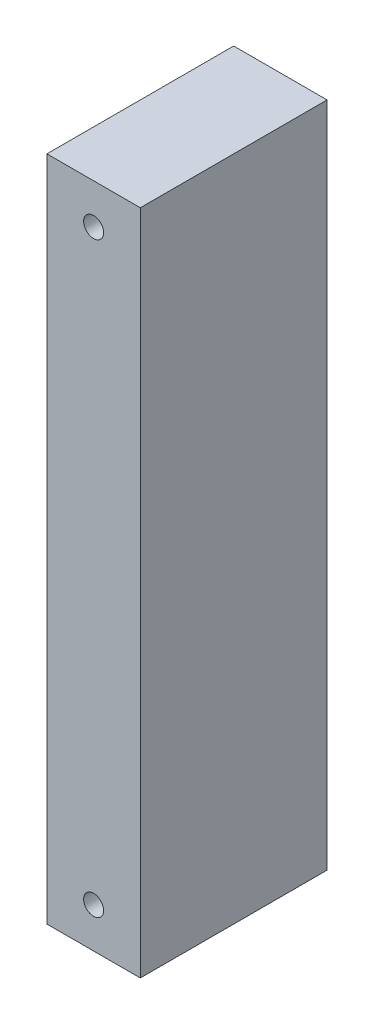
ISO-10303-21;
HEADER;
FILE_DESCRIPTION(('STEP AP214'),'2;1');
FILE_NAME('part.step','',(''),(''),'','','');
FILE_SCHEMA(('AUTOMOTIVE_DESIGN { 1 0 10303 214 1 1 1 1 }'));
ENDSEC;
DATA;
#1=APPLICATION_CONTEXT('core data for automotive mechanical design processes');
#2=APPLICATION_PROTOCOL_DEFINITION('international standard','automotive_design',2000,#1);
#3=PRODUCT_CONTEXT('',#1,'mechanical');
#4=PRODUCT('Part','Part','',(#3));
#5=PRODUCT_RELATED_PRODUCT_CATEGORY('part','',(#4));
#6=PRODUCT_DEFINITION_FORMATION('','',#4);
#7=PRODUCT_DEFINITION_CONTEXT('part definition',#1,'design');
#8=PRODUCT_DEFINITION('design','',#6,#7);
#9=PRODUCT_DEFINITION_SHAPE('','',#8);
#10=(LENGTH_UNIT() NAMED_UNIT(*) SI_UNIT(.MILLI.,.METRE.));
#11=(NAMED_UNIT(*) PLANE_ANGLE_UNIT() SI_UNIT($,.RADIAN.));
#12=(NAMED_UNIT(*) SI_UNIT($,.STERADIAN.) SOLID_ANGLE_UNIT());
#13=UNCERTAINTY_MEASURE_WITH_UNIT(LENGTH_MEASURE(1.E-05),#10,'distance_accuracy_value','');
#14=(GEOMETRIC_REPRESENTATION_CONTEXT(3) GLOBAL_UNCERTAINTY_ASSIGNED_CONTEXT((#13)) GLOBAL_UNIT_ASSIGNED_CONTEXT((#10,
#11,#12)) REPRESENTATION_CONTEXT('',''));
#15=CARTESIAN_POINT('',(0.,0.,0.));
#16=DIRECTION('',(0.,0.,1.));
#17=DIRECTION('',(1.,0.,0.));
#18=AXIS2_PLACEMENT_3D('',#15,#16,#17);
#19=CARTESIAN_POINT('',(0.,0.,14.));
#20=DIRECTION('',(0.,0.,-1.));
#21=DIRECTION('',(-1.,0.,0.));
#22=AXIS2_PLACEMENT_3D('',#19,#20,#21);
#23=PLANE('',#22);
#24=DIRECTION('',(0.,1.,0.));
#25=VECTOR('',#24,1.);
#26=CARTESIAN_POINT('',(3.5,-25.,14.));
#27=LINE('',#26,#25);
#28=CARTESIAN_POINT('',(3.5,-25.,14.));
#29=VERTEX_POINT('',#28);
#30=CARTESIAN_POINT('',(3.5,25.,14.));
#31=VERTEX_POINT('',#30);
#32=EDGE_CURVE('E85',#29,#31,#27,.T.);
#33=ORIENTED_EDGE('',*,*,#32,.T.);
#34=DIRECTION('',(-1.,0.,0.));
#35=VECTOR('',#34,1.);
#36=CARTESIAN_POINT('',(-3.5,25.,14.));
#37=LINE('',#36,#35);
#38=CARTESIAN_POINT('',(-3.5,25.,14.));
#39=VERTEX_POINT('',#38);
#40=EDGE_CURVE('E80',#31,#39,#37,.T.);
#41=ORIENTED_EDGE('',*,*,#40,.T.);
#42=DIRECTION('',(0.,-1.,0.));
#43=VECTOR('',#42,1.);
#44=CARTESIAN_POINT('',(-3.5,-25.,14.));
#45=LINE('',#44,#43);
#46=CARTESIAN_POINT('',(-3.5,-25.,14.));
#47=VERTEX_POINT('',#46);
#48=EDGE_CURVE('E83',#39,#47,#45,.T.);
#49=ORIENTED_EDGE('',*,*,#48,.T.);
#50=DIRECTION('',(1.,0.,0.));
#51=VECTOR('',#50,1.);
#52=CARTESIAN_POINT('',(-3.5,-25.,14.));
#53=LINE('',#52,#51);
#54=EDGE_CURVE('E50',#47,#29,#53,.T.);
#55=ORIENTED_EDGE('',*,*,#54,.T.);
#56=EDGE_LOOP('',(#33,#41,#49,#55));
#57=FACE_BOUND('',#56,.T.);
#58=CARTESIAN_POINT('',(0.,22.,14.));
#59=DIRECTION('',(0.,0.,1.));
#60=DIRECTION('',(1.,0.,0.));
#61=AXIS2_PLACEMENT_3D('',#58,#59,#60);
#62=CIRCLE('',#61,0.75);
#63=CARTESIAN_POINT('',(0.75,22.,14.));
#64=VERTEX_POINT('',#63);
#65=EDGE_CURVE('E100',#64,#64,#62,.T.);
#66=ORIENTED_EDGE('',*,*,#65,.F.);
#67=EDGE_LOOP('',(#66));
#68=FACE_BOUND('',#67,.T.);
#69=CARTESIAN_POINT('',(0.,-22.,14.));
#70=DIRECTION('',(0.,0.,1.));
#71=DIRECTION('',(1.,0.,0.));
#72=AXIS2_PLACEMENT_3D('',#69,#70,#71);
#73=CIRCLE('',#72,0.75);
#74=CARTESIAN_POINT('',(0.75,-22.,14.));
#75=VERTEX_POINT('',#74);
#76=EDGE_CURVE('E115',#75,#75,#73,.T.);
#77=ORIENTED_EDGE('',*,*,#76,.F.);
#78=EDGE_LOOP('',(#77));
#79=FACE_BOUND('',#78,.T.);
#80=ADVANCED_FACE('F33',(#57,#68,#79),#23,.F.);
#81=CARTESIAN_POINT('',(0.,0.,0.));
#82=DIRECTION('',(0.,0.,-1.));
#83=DIRECTION('',(-1.,0.,0.));
#84=AXIS2_PLACEMENT_3D('',#81,#82,#83);
#85=PLANE('',#84);
#86=CARTESIAN_POINT('',(0.,22.,0.));
#87=DIRECTION('',(0.,0.,1.));
#88=DIRECTION('',(1.,0.,0.));
#89=AXIS2_PLACEMENT_3D('',#86,#87,#88);
#90=CIRCLE('',#89,0.75);
#91=CARTESIAN_POINT('',(0.75,22.,0.));
#92=VERTEX_POINT('',#91);
#93=EDGE_CURVE('E112',#92,#92,#90,.T.);
#94=ORIENTED_EDGE('',*,*,#93,.T.);
#95=EDGE_LOOP('',(#94));
#96=FACE_BOUND('',#95,.T.);
#97=DIRECTION('',(0.,1.,0.));
#98=VECTOR('',#97,1.);
#99=CARTESIAN_POINT('',(3.5,-25.,0.));
#100=LINE('',#99,#98);
#101=CARTESIAN_POINT('',(3.5,-25.,0.));
#102=VERTEX_POINT('',#101);
#103=CARTESIAN_POINT('',(3.5,25.,0.));
#104=VERTEX_POINT('',#103);
#105=EDGE_CURVE('E97',#102,#104,#100,.T.);
#106=ORIENTED_EDGE('',*,*,#105,.F.);
#107=DIRECTION('',(1.,0.,0.));
#108=VECTOR('',#107,1.);
#109=CARTESIAN_POINT('',(-3.5,-25.,0.));
#110=LINE('',#109,#108);
#111=CARTESIAN_POINT('',(-3.5,-25.,0.));
#112=VERTEX_POINT('',#111);
#113=EDGE_CURVE('E73',#112,#102,#110,.T.);
#114=ORIENTED_EDGE('',*,*,#113,.F.);
#115=DIRECTION('',(0.,-1.,0.));
#116=VECTOR('',#115,1.);
#117=CARTESIAN_POINT('',(-3.5,-25.,0.));
#118=LINE('',#117,#116);
#119=CARTESIAN_POINT('',(-3.5,25.,0.));
#120=VERTEX_POINT('',#119);
#121=EDGE_CURVE('E67',#120,#112,#118,.T.);
#122=ORIENTED_EDGE('',*,*,#121,.F.);
#123=DIRECTION('',(-1.,0.,0.));
#124=VECTOR('',#123,1.);
#125=CARTESIAN_POINT('',(-3.5,25.,0.));
#126=LINE('',#125,#124);
#127=EDGE_CURVE('E89',#104,#120,#126,.T.);
#128=ORIENTED_EDGE('',*,*,#127,.F.);
#129=EDGE_LOOP('',(#106,#114,#122,#128));
#130=FACE_BOUND('',#129,.T.);
#131=CARTESIAN_POINT('',(0.,-22.,0.));
#132=DIRECTION('',(0.,0.,1.));
#133=DIRECTION('',(1.,0.,0.));
#134=AXIS2_PLACEMENT_3D('',#131,#132,#133);
#135=CIRCLE('',#134,0.75);
#136=CARTESIAN_POINT('',(0.75,-22.,0.));
#137=VERTEX_POINT('',#136);
#138=EDGE_CURVE('E118',#137,#137,#135,.T.);
#139=ORIENTED_EDGE('',*,*,#138,.T.);
#140=EDGE_LOOP('',(#139));
#141=FACE_BOUND('',#140,.T.);
#142=ADVANCED_FACE('F108',(#96,#130,#141),#85,.T.);
#143=CARTESIAN_POINT('',(3.5,-25.,14.));
#144=DIRECTION('',(-1.,0.,0.));
#145=DIRECTION('',(0.,0.,1.));
#146=AXIS2_PLACEMENT_3D('',#143,#144,#145);
#147=PLANE('',#146);
#148=ORIENTED_EDGE('',*,*,#105,.T.);
#149=DIRECTION('',(0.,0.,-1.));
#150=VECTOR('',#149,1.);
#151=CARTESIAN_POINT('',(3.5,25.,14.));
#152=LINE('',#151,#150);
#153=EDGE_CURVE('E11',#31,#104,#152,.T.);
#154=ORIENTED_EDGE('',*,*,#153,.F.);
#155=ORIENTED_EDGE('',*,*,#32,.F.);
#156=DIRECTION('',(0.,0.,-1.));
#157=VECTOR('',#156,1.);
#158=CARTESIAN_POINT('',(3.5,-25.,14.));
#159=LINE('',#158,#157);
#160=EDGE_CURVE('E93',#29,#102,#159,.T.);
#161=ORIENTED_EDGE('',*,*,#160,.T.);
#162=EDGE_LOOP('',(#148,#154,#155,#161));
#163=FACE_BOUND('',#162,.T.);
#164=ADVANCED_FACE('F35',(#163),#147,.F.);
#165=CARTESIAN_POINT('',(-3.5,25.,14.));
#166=DIRECTION('',(0.,-1.,0.));
#167=DIRECTION('',(0.,0.,-1.));
#168=AXIS2_PLACEMENT_3D('',#165,#166,#167);
#169=PLANE('',#168);
#170=ORIENTED_EDGE('',*,*,#127,.T.);
#171=DIRECTION('',(0.,0.,-1.));
#172=VECTOR('',#171,1.);
#173=CARTESIAN_POINT('',(-3.5,25.,14.));
#174=LINE('',#173,#172);
#175=EDGE_CURVE('E42',#39,#120,#174,.T.);
#176=ORIENTED_EDGE('',*,*,#175,.F.);
#177=ORIENTED_EDGE('',*,*,#40,.F.);
#178=ORIENTED_EDGE('',*,*,#153,.T.);
#179=EDGE_LOOP('',(#170,#176,#177,#178));
#180=FACE_BOUND('',#179,.T.);
#181=ADVANCED_FACE('F88',(#180),#169,.F.);
#182=CARTESIAN_POINT('',(-3.5,-25.,14.));
#183=DIRECTION('',(1.,0.,0.));
#184=DIRECTION('',(0.,0.,-1.));
#185=AXIS2_PLACEMENT_3D('',#182,#183,#184);
#186=PLANE('',#185);
#187=ORIENTED_EDGE('',*,*,#121,.T.);
#188=DIRECTION('',(0.,0.,-1.));
#189=VECTOR('',#188,1.);
#190=CARTESIAN_POINT('',(-3.5,-25.,14.));
#191=LINE('',#190,#189);
#192=EDGE_CURVE('E90',#47,#112,#191,.T.);
#193=ORIENTED_EDGE('',*,*,#192,.F.);
#194=ORIENTED_EDGE('',*,*,#48,.F.);
#195=ORIENTED_EDGE('',*,*,#175,.T.);
#196=EDGE_LOOP('',(#187,#193,#194,#195));
#197=FACE_BOUND('',#196,.T.);
#198=ADVANCED_FACE('F91',(#197),#186,.F.);
#199=CARTESIAN_POINT('',(-3.5,-25.,14.));
#200=DIRECTION('',(0.,1.,0.));
#201=DIRECTION('',(0.,0.,1.));
#202=AXIS2_PLACEMENT_3D('',#199,#200,#201);
#203=PLANE('',#202);
#204=ORIENTED_EDGE('',*,*,#113,.T.);
#205=ORIENTED_EDGE('',*,*,#160,.F.);
#206=ORIENTED_EDGE('',*,*,#54,.F.);
#207=ORIENTED_EDGE('',*,*,#192,.T.);
#208=EDGE_LOOP('',(#204,#205,#206,#207));
#209=FACE_BOUND('',#208,.T.);
#210=ADVANCED_FACE('F105',(#209),#203,.F.);
#211=CARTESIAN_POINT('',(0.,22.,14.));
#212=DIRECTION('',(0.,0.,-1.));
#213=DIRECTION('',(-1.,0.,0.));
#214=AXIS2_PLACEMENT_3D('',#211,#212,#213);
#215=CYLINDRICAL_SURFACE('',#214,0.75);
#216=ORIENTED_EDGE('',*,*,#65,.T.);
#217=EDGE_LOOP('',(#216));
#218=FACE_BOUND('',#217,.T.);
#219=ORIENTED_EDGE('',*,*,#93,.F.);
#220=EDGE_LOOP('',(#219));
#221=FACE_BOUND('',#220,.T.);
#222=ADVANCED_FACE('F135',(#218,#221),#215,.F.);
#223=CARTESIAN_POINT('',(0.,-22.,14.));
#224=DIRECTION('',(0.,0.,-1.));
#225=DIRECTION('',(-1.,0.,0.));
#226=AXIS2_PLACEMENT_3D('',#223,#224,#225);
#227=CYLINDRICAL_SURFACE('',#226,0.75);
#228=ORIENTED_EDGE('',*,*,#76,.T.);
#229=EDGE_LOOP('',(#228));
#230=FACE_BOUND('',#229,.T.);
#231=ORIENTED_EDGE('',*,*,#138,.F.);
#232=EDGE_LOOP('',(#231));
#233=FACE_BOUND('',#232,.T.);
#234=ADVANCED_FACE('F124',(#230,#233),#227,.F.);
#235=CLOSED_SHELL('',(#80,#142,#164,#181,#198,#210,#222,#234));
#236=MANIFOLD_SOLID_BREP('B2',#235);
#237=ADVANCED_BREP_SHAPE_REPRESENTATION('',(#18,#236),#14);
#238=SHAPE_DEFINITION_REPRESENTATION(#9,#237);
ENDSEC;
END-ISO-10303-21;
